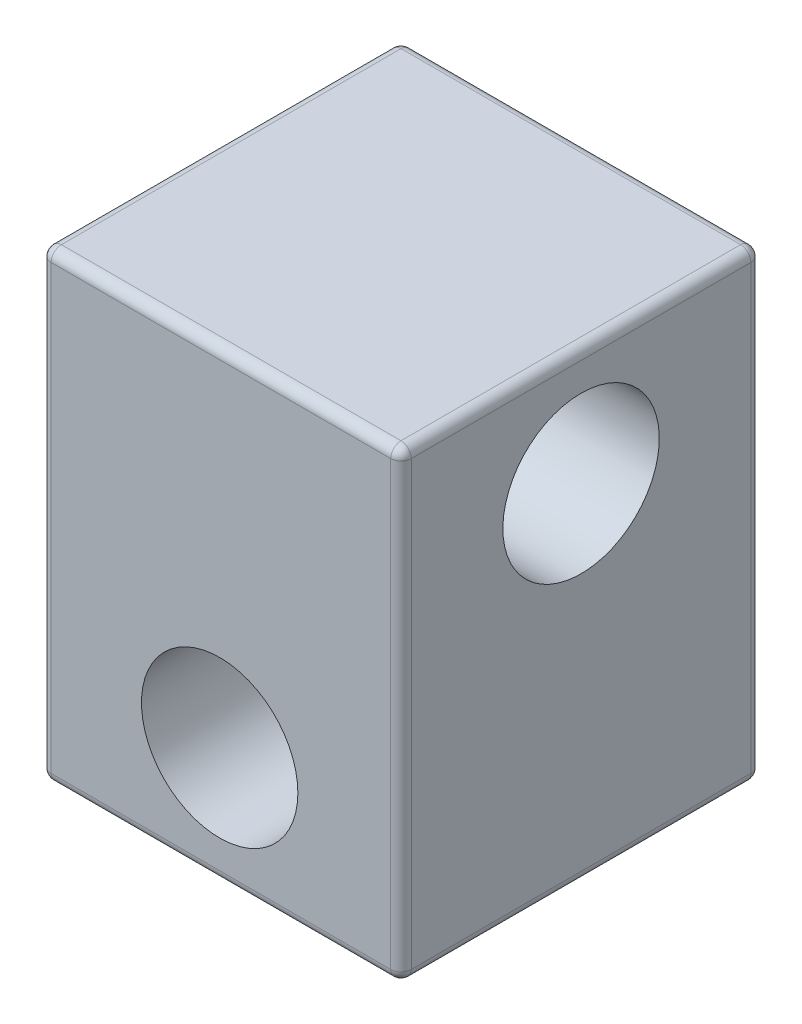
ISO-10303-21;
HEADER;
FILE_DESCRIPTION(('STEP AP214'),'2;1');
FILE_NAME('part.step','',(''),(''),'','','');
FILE_SCHEMA(('AUTOMOTIVE_DESIGN { 1 0 10303 214 1 1 1 1 }'));
ENDSEC;
DATA;
#1=APPLICATION_CONTEXT('core data for automotive mechanical design processes');
#2=APPLICATION_PROTOCOL_DEFINITION('international standard','automotive_design',2000,#1);
#3=PRODUCT_CONTEXT('',#1,'mechanical');
#4=PRODUCT('Part','Part','',(#3));
#5=PRODUCT_RELATED_PRODUCT_CATEGORY('part','',(#4));
#6=PRODUCT_DEFINITION_FORMATION('','',#4);
#7=PRODUCT_DEFINITION_CONTEXT('part definition',#1,'design');
#8=PRODUCT_DEFINITION('design','',#6,#7);
#9=PRODUCT_DEFINITION_SHAPE('','',#8);
#10=(LENGTH_UNIT() NAMED_UNIT(*) SI_UNIT(.MILLI.,.METRE.));
#11=(NAMED_UNIT(*) PLANE_ANGLE_UNIT() SI_UNIT($,.RADIAN.));
#12=(NAMED_UNIT(*) SI_UNIT($,.STERADIAN.) SOLID_ANGLE_UNIT());
#13=UNCERTAINTY_MEASURE_WITH_UNIT(LENGTH_MEASURE(1.E-05),#10,'distance_accuracy_value','');
#14=(GEOMETRIC_REPRESENTATION_CONTEXT(3) GLOBAL_UNCERTAINTY_ASSIGNED_CONTEXT((#13)) GLOBAL_UNIT_ASSIGNED_CONTEXT((#10,
#11,#12)) REPRESENTATION_CONTEXT('',''));
#15=CARTESIAN_POINT('',(0.,0.,0.));
#16=DIRECTION('',(0.,0.,1.));
#17=DIRECTION('',(1.,0.,0.));
#18=AXIS2_PLACEMENT_3D('',#15,#16,#17);
#19=CARTESIAN_POINT('',(0.,0.,35.));
#20=DIRECTION('',(0.,0.,1.));
#21=DIRECTION('',(1.,0.,0.));
#22=AXIS2_PLACEMENT_3D('',#19,#20,#21);
#23=PLANE('',#22);
#24=DIRECTION('',(1.,0.,0.));
#25=VECTOR('',#24,1.);
#26=CARTESIAN_POINT('',(17.6219613719613,-21.5,35.));
#27=LINE('',#26,#25);
#28=CARTESIAN_POINT('',(-16.3780386280387,-21.5,35.));
#29=VERTEX_POINT('',#28);
#30=CARTESIAN_POINT('',(16.6219613719613,-21.5,35.));
#31=VERTEX_POINT('',#30);
#32=EDGE_CURVE('E138',#29,#31,#27,.T.);
#33=ORIENTED_EDGE('',*,*,#32,.T.);
#34=DIRECTION('',(0.,1.,0.));
#35=VECTOR('',#34,1.);
#36=CARTESIAN_POINT('',(16.6219613719613,22.5,35.));
#37=LINE('',#36,#35);
#38=CARTESIAN_POINT('',(16.6219613719613,21.5,35.));
#39=VERTEX_POINT('',#38);
#40=EDGE_CURVE('E190',#31,#39,#37,.T.);
#41=ORIENTED_EDGE('',*,*,#40,.T.);
#42=DIRECTION('',(-1.,0.,0.));
#43=VECTOR('',#42,1.);
#44=CARTESIAN_POINT('',(-17.3780386280387,21.5,35.));
#45=LINE('',#44,#43);
#46=CARTESIAN_POINT('',(-16.3780386280387,21.5,35.));
#47=VERTEX_POINT('',#46);
#48=EDGE_CURVE('E185',#39,#47,#45,.T.);
#49=ORIENTED_EDGE('',*,*,#48,.T.);
#50=DIRECTION('',(0.,-1.,0.));
#51=VECTOR('',#50,1.);
#52=CARTESIAN_POINT('',(-16.3780386280387,-22.5,35.));
#53=LINE('',#52,#51);
#54=EDGE_CURVE('E187',#47,#29,#53,.T.);
#55=ORIENTED_EDGE('',*,*,#54,.T.);
#56=EDGE_LOOP('',(#33,#41,#49,#55));
#57=FACE_BOUND('',#56,.T.);
#58=CARTESIAN_POINT('',(0.,-11.15,35.));
#59=DIRECTION('',(0.,0.,1.));
#60=DIRECTION('',(1.,0.,0.));
#61=AXIS2_PLACEMENT_3D('',#58,#59,#60);
#62=CIRCLE('',#61,7.6);
#63=CARTESIAN_POINT('',(7.6,-11.15,35.));
#64=VERTEX_POINT('',#63);
#65=EDGE_CURVE('E157',#64,#64,#62,.T.);
#66=ORIENTED_EDGE('',*,*,#65,.F.);
#67=EDGE_LOOP('',(#66));
#68=FACE_BOUND('',#67,.T.);
#69=ADVANCED_FACE('F32',(#57,#68),#23,.T.);
#70=CARTESIAN_POINT('',(0.,0.,0.));
#71=DIRECTION('',(0.,0.,1.));
#72=DIRECTION('',(1.,0.,0.));
#73=AXIS2_PLACEMENT_3D('',#70,#71,#72);
#74=PLANE('',#73);
#75=DIRECTION('',(0.,1.,0.));
#76=VECTOR('',#75,1.);
#77=CARTESIAN_POINT('',(16.6219613719613,0.,0.));
#78=LINE('',#77,#76);
#79=CARTESIAN_POINT('',(16.6219613719613,21.5,0.));
#80=VERTEX_POINT('',#79);
#81=CARTESIAN_POINT('',(16.6219613719613,-21.5,0.));
#82=VERTEX_POINT('',#81);
#83=EDGE_CURVE('E171',#80,#82,#78,.F.);
#84=ORIENTED_EDGE('',*,*,#83,.T.);
#85=DIRECTION('',(1.,0.,0.));
#86=VECTOR('',#85,1.);
#87=CARTESIAN_POINT('',(0.,-21.5,0.));
#88=LINE('',#87,#86);
#89=CARTESIAN_POINT('',(-16.3780386280387,-21.5,0.));
#90=VERTEX_POINT('',#89);
#91=EDGE_CURVE('E173',#82,#90,#88,.F.);
#92=ORIENTED_EDGE('',*,*,#91,.T.);
#93=DIRECTION('',(0.,-1.,0.));
#94=VECTOR('',#93,1.);
#95=CARTESIAN_POINT('',(-16.3780386280387,0.,0.));
#96=LINE('',#95,#94);
#97=CARTESIAN_POINT('',(-16.3780386280387,21.5,0.));
#98=VERTEX_POINT('',#97);
#99=EDGE_CURVE('E169',#90,#98,#96,.F.);
#100=ORIENTED_EDGE('',*,*,#99,.T.);
#101=DIRECTION('',(-1.,0.,0.));
#102=VECTOR('',#101,1.);
#103=CARTESIAN_POINT('',(0.,21.5,0.));
#104=LINE('',#103,#102);
#105=EDGE_CURVE('E167',#98,#80,#104,.F.);
#106=ORIENTED_EDGE('',*,*,#105,.T.);
#107=EDGE_LOOP('',(#84,#92,#100,#106));
#108=FACE_BOUND('',#107,.T.);
#109=CARTESIAN_POINT('',(0.,-11.15,0.));
#110=DIRECTION('',(0.,0.,1.));
#111=DIRECTION('',(1.,0.,0.));
#112=AXIS2_PLACEMENT_3D('',#109,#110,#111);
#113=CIRCLE('',#112,7.6);
#114=CARTESIAN_POINT('',(7.6,-11.15,0.));
#115=VERTEX_POINT('',#114);
#116=EDGE_CURVE('E160',#115,#115,#113,.T.);
#117=ORIENTED_EDGE('',*,*,#116,.T.);
#118=EDGE_LOOP('',(#117));
#119=FACE_BOUND('',#118,.T.);
#120=ADVANCED_FACE('F276',(#108,#119),#74,.F.);
#121=CARTESIAN_POINT('',(-17.3780386280387,22.5,35.));
#122=DIRECTION('',(1.,0.,0.));
#123=DIRECTION('',(0.,1.,0.));
#124=AXIS2_PLACEMENT_3D('',#121,#122,#123);
#125=PLANE('',#124);
#126=DIRECTION('',(0.,-1.,0.));
#127=VECTOR('',#126,1.);
#128=CARTESIAN_POINT('',(-17.3780386280387,22.5,1.));
#129=LINE('',#128,#127);
#130=CARTESIAN_POINT('',(-17.3780386280387,21.5,1.));
#131=VERTEX_POINT('',#130);
#132=CARTESIAN_POINT('',(-17.3780386280387,-21.5,1.));
#133=VERTEX_POINT('',#132);
#134=EDGE_CURVE('E197',#131,#133,#129,.T.);
#135=ORIENTED_EDGE('',*,*,#134,.T.);
#136=DIRECTION('',(0.,0.,-1.));
#137=VECTOR('',#136,1.);
#138=CARTESIAN_POINT('',(-17.3780386280387,-21.5,35.));
#139=LINE('',#138,#137);
#140=CARTESIAN_POINT('',(-17.3780386280387,-21.5,34.));
#141=VERTEX_POINT('',#140);
#142=EDGE_CURVE('E199',#133,#141,#139,.F.);
#143=ORIENTED_EDGE('',*,*,#142,.T.);
#144=DIRECTION('',(0.,-1.,0.));
#145=VECTOR('',#144,1.);
#146=CARTESIAN_POINT('',(-17.3780386280387,22.5,34.));
#147=LINE('',#146,#145);
#148=CARTESIAN_POINT('',(-17.3780386280387,21.5,34.));
#149=VERTEX_POINT('',#148);
#150=EDGE_CURVE('E195',#141,#149,#147,.F.);
#151=ORIENTED_EDGE('',*,*,#150,.T.);
#152=DIRECTION('',(0.,0.,-1.));
#153=VECTOR('',#152,1.);
#154=CARTESIAN_POINT('',(-17.3780386280387,21.5,35.));
#155=LINE('',#154,#153);
#156=EDGE_CURVE('E193',#149,#131,#155,.T.);
#157=ORIENTED_EDGE('',*,*,#156,.T.);
#158=EDGE_LOOP('',(#135,#143,#151,#157));
#159=FACE_BOUND('',#158,.T.);
#160=CARTESIAN_POINT('',(-17.3780386280387,11.15,17.5));
#161=DIRECTION('',(1.,0.,0.));
#162=DIRECTION('',(0.,1.,0.));
#163=AXIS2_PLACEMENT_3D('',#160,#161,#162);
#164=CIRCLE('',#163,7.6);
#165=CARTESIAN_POINT('',(-17.3780386280387,18.75,17.5));
#166=VERTEX_POINT('',#165);
#167=EDGE_CURVE('E265',#166,#166,#164,.T.);
#168=ORIENTED_EDGE('',*,*,#167,.T.);
#169=EDGE_LOOP('',(#168));
#170=FACE_BOUND('',#169,.T.);
#171=ADVANCED_FACE('F298',(#159,#170),#125,.F.);
#172=CARTESIAN_POINT('',(-17.3780386280387,-22.5,35.));
#173=DIRECTION('',(0.,1.,0.));
#174=DIRECTION('',(0.,0.,1.));
#175=AXIS2_PLACEMENT_3D('',#172,#173,#174);
#176=PLANE('',#175);
#177=DIRECTION('',(0.,0.,-1.));
#178=VECTOR('',#177,1.);
#179=CARTESIAN_POINT('',(-16.3780386280387,-22.5,35.));
#180=LINE('',#179,#178);
#181=CARTESIAN_POINT('',(-16.3780386280387,-22.5,34.));
#182=VERTEX_POINT('',#181);
#183=CARTESIAN_POINT('',(-16.3780386280387,-22.5,1.));
#184=VERTEX_POINT('',#183);
#185=EDGE_CURVE('E125',#182,#184,#180,.T.);
#186=ORIENTED_EDGE('',*,*,#185,.T.);
#187=DIRECTION('',(1.,0.,0.));
#188=VECTOR('',#187,1.);
#189=CARTESIAN_POINT('',(-17.3780386280387,-22.5,1.));
#190=LINE('',#189,#188);
#191=CARTESIAN_POINT('',(16.6219613719613,-22.5,1.));
#192=VERTEX_POINT('',#191);
#193=EDGE_CURVE('E165',#184,#192,#190,.T.);
#194=ORIENTED_EDGE('',*,*,#193,.T.);
#195=DIRECTION('',(0.,0.,-1.));
#196=VECTOR('',#195,1.);
#197=CARTESIAN_POINT('',(16.6219613719613,-22.5,35.));
#198=LINE('',#197,#196);
#199=CARTESIAN_POINT('',(16.6219613719613,-22.5,34.));
#200=VERTEX_POINT('',#199);
#201=EDGE_CURVE('E128',#192,#200,#198,.F.);
#202=ORIENTED_EDGE('',*,*,#201,.T.);
#203=DIRECTION('',(1.,0.,0.));
#204=VECTOR('',#203,1.);
#205=CARTESIAN_POINT('',(-17.3780386280387,-22.5,34.));
#206=LINE('',#205,#204);
#207=EDGE_CURVE('E120',#200,#182,#206,.F.);
#208=ORIENTED_EDGE('',*,*,#207,.T.);
#209=EDGE_LOOP('',(#186,#194,#202,#208));
#210=FACE_BOUND('',#209,.T.);
#211=ADVANCED_FACE('F122',(#210),#176,.F.);
#212=CARTESIAN_POINT('',(17.6219613719613,22.5,35.));
#213=DIRECTION('',(-1.,0.,0.));
#214=DIRECTION('',(0.,-1.,0.));
#215=AXIS2_PLACEMENT_3D('',#212,#213,#214);
#216=PLANE('',#215);
#217=DIRECTION('',(0.,1.,0.));
#218=VECTOR('',#217,1.);
#219=CARTESIAN_POINT('',(17.6219613719613,-22.5,34.));
#220=LINE('',#219,#218);
#221=CARTESIAN_POINT('',(17.6219613719613,21.5,34.));
#222=VERTEX_POINT('',#221);
#223=CARTESIAN_POINT('',(17.6219613719613,-21.5,34.));
#224=VERTEX_POINT('',#223);
#225=EDGE_CURVE('E178',#222,#224,#220,.F.);
#226=ORIENTED_EDGE('',*,*,#225,.T.);
#227=DIRECTION('',(0.,0.,-1.));
#228=VECTOR('',#227,1.);
#229=CARTESIAN_POINT('',(17.6219613719613,-21.5,35.));
#230=LINE('',#229,#228);
#231=CARTESIAN_POINT('',(17.6219613719613,-21.5,1.));
#232=VERTEX_POINT('',#231);
#233=EDGE_CURVE('E182',#224,#232,#230,.T.);
#234=ORIENTED_EDGE('',*,*,#233,.T.);
#235=DIRECTION('',(0.,1.,0.));
#236=VECTOR('',#235,1.);
#237=CARTESIAN_POINT('',(17.6219613719613,22.5,1.));
#238=LINE('',#237,#236);
#239=CARTESIAN_POINT('',(17.6219613719613,21.5,1.));
#240=VERTEX_POINT('',#239);
#241=EDGE_CURVE('E180',#232,#240,#238,.T.);
#242=ORIENTED_EDGE('',*,*,#241,.T.);
#243=DIRECTION('',(0.,0.,-1.));
#244=VECTOR('',#243,1.);
#245=CARTESIAN_POINT('',(17.6219613719613,21.5,35.));
#246=LINE('',#245,#244);
#247=EDGE_CURVE('E176',#240,#222,#246,.F.);
#248=ORIENTED_EDGE('',*,*,#247,.T.);
#249=EDGE_LOOP('',(#226,#234,#242,#248));
#250=FACE_BOUND('',#249,.T.);
#251=CARTESIAN_POINT('',(17.6219613719613,11.15,17.5));
#252=DIRECTION('',(1.,0.,0.));
#253=DIRECTION('',(0.,1.,0.));
#254=AXIS2_PLACEMENT_3D('',#251,#252,#253);
#255=CIRCLE('',#254,7.6);
#256=CARTESIAN_POINT('',(17.6219613719613,18.75,17.5));
#257=VERTEX_POINT('',#256);
#258=EDGE_CURVE('E259',#257,#257,#255,.T.);
#259=ORIENTED_EDGE('',*,*,#258,.F.);
#260=EDGE_LOOP('',(#259));
#261=FACE_BOUND('',#260,.T.);
#262=ADVANCED_FACE('F290',(#250,#261),#216,.F.);
#263=CARTESIAN_POINT('',(-17.3780386280387,22.5,35.));
#264=DIRECTION('',(0.,-1.,0.));
#265=DIRECTION('',(0.,0.,-1.));
#266=AXIS2_PLACEMENT_3D('',#263,#264,#265);
#267=PLANE('',#266);
#268=DIRECTION('',(0.,0.,-1.));
#269=VECTOR('',#268,1.);
#270=CARTESIAN_POINT('',(16.6219613719613,22.5,35.));
#271=LINE('',#270,#269);
#272=CARTESIAN_POINT('',(16.6219613719613,22.5,34.));
#273=VERTEX_POINT('',#272);
#274=CARTESIAN_POINT('',(16.6219613719613,22.5,1.));
#275=VERTEX_POINT('',#274);
#276=EDGE_CURVE('E41',#273,#275,#271,.T.);
#277=ORIENTED_EDGE('',*,*,#276,.T.);
#278=DIRECTION('',(-1.,0.,0.));
#279=VECTOR('',#278,1.);
#280=CARTESIAN_POINT('',(-17.3780386280387,22.5,1.));
#281=LINE('',#280,#279);
#282=CARTESIAN_POINT('',(-16.3780386280387,22.5,1.));
#283=VERTEX_POINT('',#282);
#284=EDGE_CURVE('E11',#275,#283,#281,.T.);
#285=ORIENTED_EDGE('',*,*,#284,.T.);
#286=DIRECTION('',(0.,0.,-1.));
#287=VECTOR('',#286,1.);
#288=CARTESIAN_POINT('',(-16.3780386280387,22.5,35.));
#289=LINE('',#288,#287);
#290=CARTESIAN_POINT('',(-16.3780386280387,22.5,34.));
#291=VERTEX_POINT('',#290);
#292=EDGE_CURVE('E202',#283,#291,#289,.F.);
#293=ORIENTED_EDGE('',*,*,#292,.T.);
#294=DIRECTION('',(-1.,0.,0.));
#295=VECTOR('',#294,1.);
#296=CARTESIAN_POINT('',(17.6219613719613,22.5,34.));
#297=LINE('',#296,#295);
#298=EDGE_CURVE('E52',#291,#273,#297,.F.);
#299=ORIENTED_EDGE('',*,*,#298,.T.);
#300=EDGE_LOOP('',(#277,#285,#293,#299));
#301=FACE_BOUND('',#300,.T.);
#302=ADVANCED_FACE('F281',(#301),#267,.F.);
#303=CARTESIAN_POINT('',(0.,-11.15,35.));
#304=DIRECTION('',(0.,0.,-1.));
#305=DIRECTION('',(-1.,0.,0.));
#306=AXIS2_PLACEMENT_3D('',#303,#304,#305);
#307=CYLINDRICAL_SURFACE('',#306,7.6);
#308=ORIENTED_EDGE('',*,*,#65,.T.);
#309=EDGE_LOOP('',(#308));
#310=FACE_BOUND('',#309,.T.);
#311=ORIENTED_EDGE('',*,*,#116,.F.);
#312=EDGE_LOOP('',(#311));
#313=FACE_BOUND('',#312,.T.);
#314=ADVANCED_FACE('F278',(#310,#313),#307,.F.);
#315=CARTESIAN_POINT('',(-17.3780386280387,11.15,17.5));
#316=DIRECTION('',(1.,0.,0.));
#317=DIRECTION('',(0.,1.,0.));
#318=AXIS2_PLACEMENT_3D('',#315,#316,#317);
#319=CYLINDRICAL_SURFACE('',#318,7.6);
#320=ORIENTED_EDGE('',*,*,#167,.F.);
#321=EDGE_LOOP('',(#320));
#322=FACE_BOUND('',#321,.T.);
#323=ORIENTED_EDGE('',*,*,#258,.T.);
#324=EDGE_LOOP('',(#323));
#325=FACE_BOUND('',#324,.T.);
#326=ADVANCED_FACE('F280',(#322,#325),#319,.F.);
#327=CARTESIAN_POINT('',(0.,21.5,34.));
#328=DIRECTION('',(1.,0.,0.));
#329=DIRECTION('',(0.,0.,-1.));
#330=AXIS2_PLACEMENT_3D('',#327,#328,#329);
#331=CYLINDRICAL_SURFACE('',#330,1.);
#332=CARTESIAN_POINT('',(-16.3780386280387,21.5,34.));
#333=DIRECTION('',(-1.,0.,0.));
#334=DIRECTION('',(0.,-1.,0.));
#335=AXIS2_PLACEMENT_3D('',#332,#333,#334);
#336=CIRCLE('',#335,1.);
#337=EDGE_CURVE('E36',#47,#291,#336,.T.);
#338=ORIENTED_EDGE('',*,*,#337,.F.);
#339=ORIENTED_EDGE('',*,*,#48,.F.);
#340=CARTESIAN_POINT('',(16.6219613719613,21.5,34.));
#341=DIRECTION('',(1.,0.,0.));
#342=DIRECTION('',(0.,0.,-1.));
#343=AXIS2_PLACEMENT_3D('',#340,#341,#342);
#344=CIRCLE('',#343,1.);
#345=EDGE_CURVE('E252',#273,#39,#344,.T.);
#346=ORIENTED_EDGE('',*,*,#345,.F.);
#347=ORIENTED_EDGE('',*,*,#298,.F.);
#348=EDGE_LOOP('',(#338,#339,#346,#347));
#349=FACE_BOUND('',#348,.T.);
#350=ADVANCED_FACE('F34',(#349),#331,.T.);
#351=CARTESIAN_POINT('',(-16.3780386280387,21.5,34.));
#352=DIRECTION('',(0.,0.,1.));
#353=DIRECTION('',(1.,0.,0.));
#354=AXIS2_PLACEMENT_3D('',#351,#352,#353);
#355=SPHERICAL_SURFACE('',#354,1.);
#356=CARTESIAN_POINT('',(-16.3780386280387,21.5,34.));
#357=DIRECTION('',(0.,1.,0.));
#358=DIRECTION('',(0.,0.,1.));
#359=AXIS2_PLACEMENT_3D('',#356,#357,#358);
#360=CIRCLE('',#359,1.);
#361=EDGE_CURVE('E247',#47,#149,#360,.F.);
#362=ORIENTED_EDGE('',*,*,#361,.F.);
#363=ORIENTED_EDGE('',*,*,#337,.T.);
#364=CARTESIAN_POINT('',(-16.3780386280387,21.5,34.));
#365=DIRECTION('',(0.,0.,1.));
#366=DIRECTION('',(1.,0.,0.));
#367=AXIS2_PLACEMENT_3D('',#364,#365,#366);
#368=CIRCLE('',#367,1.);
#369=EDGE_CURVE('E250',#149,#291,#368,.F.);
#370=ORIENTED_EDGE('',*,*,#369,.F.);
#371=EDGE_LOOP('',(#362,#363,#370));
#372=FACE_BOUND('',#371,.T.);
#373=ADVANCED_FACE('F375',(#372),#355,.T.);
#374=CARTESIAN_POINT('',(16.6219613719613,21.5,34.));
#375=DIRECTION('',(0.,0.,1.));
#376=DIRECTION('',(1.,0.,0.));
#377=AXIS2_PLACEMENT_3D('',#374,#375,#376);
#378=SPHERICAL_SURFACE('',#377,1.);
#379=CARTESIAN_POINT('',(16.6219613719613,21.5,34.));
#380=DIRECTION('',(0.,0.,1.));
#381=DIRECTION('',(1.,0.,0.));
#382=AXIS2_PLACEMENT_3D('',#379,#380,#381);
#383=CIRCLE('',#382,1.);
#384=EDGE_CURVE('E242',#273,#222,#383,.F.);
#385=ORIENTED_EDGE('',*,*,#384,.F.);
#386=ORIENTED_EDGE('',*,*,#345,.T.);
#387=CARTESIAN_POINT('',(16.6219613719613,21.5,34.));
#388=DIRECTION('',(0.,1.,0.));
#389=DIRECTION('',(0.,0.,1.));
#390=AXIS2_PLACEMENT_3D('',#387,#388,#389);
#391=CIRCLE('',#390,1.);
#392=EDGE_CURVE('E245',#222,#39,#391,.F.);
#393=ORIENTED_EDGE('',*,*,#392,.F.);
#394=EDGE_LOOP('',(#385,#386,#393));
#395=FACE_BOUND('',#394,.T.);
#396=ADVANCED_FACE('F372',(#395),#378,.T.);
#397=CARTESIAN_POINT('',(-16.3780386280387,21.5,35.));
#398=DIRECTION('',(0.,0.,-1.));
#399=DIRECTION('',(-1.,0.,0.));
#400=AXIS2_PLACEMENT_3D('',#397,#398,#399);
#401=CYLINDRICAL_SURFACE('',#400,1.);
#402=ORIENTED_EDGE('',*,*,#369,.T.);
#403=ORIENTED_EDGE('',*,*,#292,.F.);
#404=CARTESIAN_POINT('',(-16.3780386280387,21.5,1.));
#405=DIRECTION('',(0.,0.,-1.));
#406=DIRECTION('',(-1.,0.,0.));
#407=AXIS2_PLACEMENT_3D('',#404,#405,#406);
#408=CIRCLE('',#407,1.);
#409=EDGE_CURVE('E237',#131,#283,#408,.T.);
#410=ORIENTED_EDGE('',*,*,#409,.F.);
#411=ORIENTED_EDGE('',*,*,#156,.F.);
#412=EDGE_LOOP('',(#402,#403,#410,#411));
#413=FACE_BOUND('',#412,.T.);
#414=ADVANCED_FACE('F368',(#413),#401,.T.);
#415=CARTESIAN_POINT('',(-16.3780386280387,0.,34.));
#416=DIRECTION('',(0.,1.,0.));
#417=DIRECTION('',(-1.,0.,0.));
#418=AXIS2_PLACEMENT_3D('',#415,#416,#417);
#419=CYLINDRICAL_SURFACE('',#418,1.);
#420=ORIENTED_EDGE('',*,*,#361,.T.);
#421=ORIENTED_EDGE('',*,*,#150,.F.);
#422=CARTESIAN_POINT('',(-16.3780386280387,-21.5,34.));
#423=DIRECTION('',(0.,-1.,0.));
#424=DIRECTION('',(0.,0.,-1.));
#425=AXIS2_PLACEMENT_3D('',#422,#423,#424);
#426=CIRCLE('',#425,1.);
#427=EDGE_CURVE('E142',#29,#141,#426,.T.);
#428=ORIENTED_EDGE('',*,*,#427,.F.);
#429=ORIENTED_EDGE('',*,*,#54,.F.);
#430=EDGE_LOOP('',(#420,#421,#428,#429));
#431=FACE_BOUND('',#430,.T.);
#432=ADVANCED_FACE('F365',(#431),#419,.T.);
#433=CARTESIAN_POINT('',(0.,-21.5,34.));
#434=DIRECTION('',(-1.,0.,0.));
#435=DIRECTION('',(0.,0.,1.));
#436=AXIS2_PLACEMENT_3D('',#433,#434,#435);
#437=CYLINDRICAL_SURFACE('',#436,1.);
#438=CARTESIAN_POINT('',(16.6219613719613,-21.5,34.));
#439=DIRECTION('',(1.,0.,0.));
#440=DIRECTION('',(0.,0.,-1.));
#441=AXIS2_PLACEMENT_3D('',#438,#439,#440);
#442=CIRCLE('',#441,1.);
#443=EDGE_CURVE('E143',#31,#200,#442,.T.);
#444=ORIENTED_EDGE('',*,*,#443,.F.);
#445=ORIENTED_EDGE('',*,*,#32,.F.);
#446=CARTESIAN_POINT('',(-16.3780386280387,-21.5,34.));
#447=DIRECTION('',(-1.,0.,0.));
#448=DIRECTION('',(0.,0.,1.));
#449=AXIS2_PLACEMENT_3D('',#446,#447,#448);
#450=CIRCLE('',#449,1.);
#451=EDGE_CURVE('E135',#182,#29,#450,.T.);
#452=ORIENTED_EDGE('',*,*,#451,.F.);
#453=ORIENTED_EDGE('',*,*,#207,.F.);
#454=EDGE_LOOP('',(#444,#445,#452,#453));
#455=FACE_BOUND('',#454,.T.);
#456=ADVANCED_FACE('F137',(#455),#437,.T.);
#457=CARTESIAN_POINT('',(16.6219613719613,0.,34.));
#458=DIRECTION('',(0.,-1.,0.));
#459=DIRECTION('',(1.,0.,0.));
#460=AXIS2_PLACEMENT_3D('',#457,#458,#459);
#461=CYLINDRICAL_SURFACE('',#460,1.);
#462=ORIENTED_EDGE('',*,*,#392,.T.);
#463=ORIENTED_EDGE('',*,*,#40,.F.);
#464=CARTESIAN_POINT('',(16.6219613719613,-21.5,34.));
#465=DIRECTION('',(0.,-1.,0.));
#466=DIRECTION('',(0.,0.,-1.));
#467=AXIS2_PLACEMENT_3D('',#464,#465,#466);
#468=CIRCLE('',#467,1.);
#469=EDGE_CURVE('E232',#224,#31,#468,.T.);
#470=ORIENTED_EDGE('',*,*,#469,.F.);
#471=ORIENTED_EDGE('',*,*,#225,.F.);
#472=EDGE_LOOP('',(#462,#463,#470,#471));
#473=FACE_BOUND('',#472,.T.);
#474=ADVANCED_FACE('F358',(#473),#461,.T.);
#475=CARTESIAN_POINT('',(16.6219613719613,21.5,35.));
#476=DIRECTION('',(0.,0.,-1.));
#477=DIRECTION('',(-1.,0.,0.));
#478=AXIS2_PLACEMENT_3D('',#475,#476,#477);
#479=CYLINDRICAL_SURFACE('',#478,1.);
#480=ORIENTED_EDGE('',*,*,#384,.T.);
#481=ORIENTED_EDGE('',*,*,#247,.F.);
#482=CARTESIAN_POINT('',(16.6219613719613,21.5,1.));
#483=DIRECTION('',(0.,0.,-1.));
#484=DIRECTION('',(-1.,0.,0.));
#485=AXIS2_PLACEMENT_3D('',#482,#483,#484);
#486=CIRCLE('',#485,1.);
#487=EDGE_CURVE('E229',#275,#240,#486,.T.);
#488=ORIENTED_EDGE('',*,*,#487,.F.);
#489=ORIENTED_EDGE('',*,*,#276,.F.);
#490=EDGE_LOOP('',(#480,#481,#488,#489));
#491=FACE_BOUND('',#490,.T.);
#492=ADVANCED_FACE('F354',(#491),#479,.T.);
#493=CARTESIAN_POINT('',(-17.3780386280387,21.5,1.));
#494=DIRECTION('',(-1.,0.,0.));
#495=DIRECTION('',(0.,0.,1.));
#496=AXIS2_PLACEMENT_3D('',#493,#494,#495);
#497=CYLINDRICAL_SURFACE('',#496,1.);
#498=CARTESIAN_POINT('',(-16.3780386280387,21.5,1.));
#499=DIRECTION('',(-1.,0.,0.));
#500=DIRECTION('',(0.,0.,1.));
#501=AXIS2_PLACEMENT_3D('',#498,#499,#500);
#502=CIRCLE('',#501,1.);
#503=EDGE_CURVE('E239',#283,#98,#502,.T.);
#504=ORIENTED_EDGE('',*,*,#503,.F.);
#505=ORIENTED_EDGE('',*,*,#284,.F.);
#506=CARTESIAN_POINT('',(16.6219613719613,21.5,1.));
#507=DIRECTION('',(1.,0.,0.));
#508=DIRECTION('',(0.,1.,0.));
#509=AXIS2_PLACEMENT_3D('',#506,#507,#508);
#510=CIRCLE('',#509,1.);
#511=EDGE_CURVE('E226',#80,#275,#510,.T.);
#512=ORIENTED_EDGE('',*,*,#511,.F.);
#513=ORIENTED_EDGE('',*,*,#105,.F.);
#514=EDGE_LOOP('',(#504,#505,#512,#513));
#515=FACE_BOUND('',#514,.T.);
#516=ADVANCED_FACE('F350',(#515),#497,.T.);
#517=CARTESIAN_POINT('',(-16.3780386280387,21.5,1.));
#518=DIRECTION('',(0.,0.,1.));
#519=DIRECTION('',(1.,0.,0.));
#520=AXIS2_PLACEMENT_3D('',#517,#518,#519);
#521=SPHERICAL_SURFACE('',#520,1.);
#522=ORIENTED_EDGE('',*,*,#409,.T.);
#523=ORIENTED_EDGE('',*,*,#503,.T.);
#524=CARTESIAN_POINT('',(-16.3780386280387,21.5,1.));
#525=DIRECTION('',(0.,1.,0.));
#526=DIRECTION('',(0.,0.,1.));
#527=AXIS2_PLACEMENT_3D('',#524,#525,#526);
#528=CIRCLE('',#527,1.);
#529=EDGE_CURVE('E150',#131,#98,#528,.F.);
#530=ORIENTED_EDGE('',*,*,#529,.F.);
#531=EDGE_LOOP('',(#522,#523,#530));
#532=FACE_BOUND('',#531,.T.);
#533=ADVANCED_FACE('F347',(#532),#521,.T.);
#534=CARTESIAN_POINT('',(-16.3780386280387,-21.5,34.));
#535=DIRECTION('',(0.,0.,1.));
#536=DIRECTION('',(1.,0.,0.));
#537=AXIS2_PLACEMENT_3D('',#534,#535,#536);
#538=SPHERICAL_SURFACE('',#537,1.);
#539=ORIENTED_EDGE('',*,*,#451,.T.);
#540=ORIENTED_EDGE('',*,*,#427,.T.);
#541=CARTESIAN_POINT('',(-16.3780386280387,-21.5,34.));
#542=DIRECTION('',(0.,0.,1.));
#543=DIRECTION('',(1.,0.,0.));
#544=AXIS2_PLACEMENT_3D('',#541,#542,#543);
#545=CIRCLE('',#544,1.);
#546=EDGE_CURVE('E145',#182,#141,#545,.F.);
#547=ORIENTED_EDGE('',*,*,#546,.F.);
#548=EDGE_LOOP('',(#539,#540,#547));
#549=FACE_BOUND('',#548,.T.);
#550=ADVANCED_FACE('F146',(#549),#538,.T.);
#551=CARTESIAN_POINT('',(16.6219613719613,-21.5,34.));
#552=DIRECTION('',(0.,0.,1.));
#553=DIRECTION('',(1.,0.,0.));
#554=AXIS2_PLACEMENT_3D('',#551,#552,#553);
#555=SPHERICAL_SURFACE('',#554,1.);
#556=ORIENTED_EDGE('',*,*,#469,.T.);
#557=ORIENTED_EDGE('',*,*,#443,.T.);
#558=CARTESIAN_POINT('',(16.6219613719613,-21.5,34.));
#559=DIRECTION('',(0.,0.,1.));
#560=DIRECTION('',(1.,0.,0.));
#561=AXIS2_PLACEMENT_3D('',#558,#559,#560);
#562=CIRCLE('',#561,1.);
#563=EDGE_CURVE('E151',#224,#200,#562,.F.);
#564=ORIENTED_EDGE('',*,*,#563,.F.);
#565=EDGE_LOOP('',(#556,#557,#564));
#566=FACE_BOUND('',#565,.T.);
#567=ADVANCED_FACE('F340',(#566),#555,.T.);
#568=CARTESIAN_POINT('',(16.6219613719613,21.5,1.));
#569=DIRECTION('',(0.,0.,1.));
#570=DIRECTION('',(1.,0.,0.));
#571=AXIS2_PLACEMENT_3D('',#568,#569,#570);
#572=SPHERICAL_SURFACE('',#571,1.);
#573=ORIENTED_EDGE('',*,*,#511,.T.);
#574=ORIENTED_EDGE('',*,*,#487,.T.);
#575=CARTESIAN_POINT('',(16.6219613719613,21.5,1.));
#576=DIRECTION('',(0.,1.,0.));
#577=DIRECTION('',(0.,0.,1.));
#578=AXIS2_PLACEMENT_3D('',#575,#576,#577);
#579=CIRCLE('',#578,1.);
#580=EDGE_CURVE('E219',#80,#240,#579,.F.);
#581=ORIENTED_EDGE('',*,*,#580,.F.);
#582=EDGE_LOOP('',(#573,#574,#581));
#583=FACE_BOUND('',#582,.T.);
#584=ADVANCED_FACE('F336',(#583),#572,.T.);
#585=CARTESIAN_POINT('',(-16.3780386280387,22.5,1.));
#586=DIRECTION('',(0.,-1.,0.));
#587=DIRECTION('',(1.,0.,0.));
#588=AXIS2_PLACEMENT_3D('',#585,#586,#587);
#589=CYLINDRICAL_SURFACE('',#588,1.);
#590=ORIENTED_EDGE('',*,*,#529,.T.);
#591=ORIENTED_EDGE('',*,*,#99,.F.);
#592=CARTESIAN_POINT('',(-16.3780386280387,-21.5,1.));
#593=DIRECTION('',(0.,-1.,0.));
#594=DIRECTION('',(0.,0.,-1.));
#595=AXIS2_PLACEMENT_3D('',#592,#593,#594);
#596=CIRCLE('',#595,1.);
#597=EDGE_CURVE('E216',#133,#90,#596,.T.);
#598=ORIENTED_EDGE('',*,*,#597,.F.);
#599=ORIENTED_EDGE('',*,*,#134,.F.);
#600=EDGE_LOOP('',(#590,#591,#598,#599));
#601=FACE_BOUND('',#600,.T.);
#602=ADVANCED_FACE('F333',(#601),#589,.T.);
#603=CARTESIAN_POINT('',(-16.3780386280387,-21.5,35.));
#604=DIRECTION('',(0.,0.,-1.));
#605=DIRECTION('',(-1.,0.,0.));
#606=AXIS2_PLACEMENT_3D('',#603,#604,#605);
#607=CYLINDRICAL_SURFACE('',#606,1.);
#608=ORIENTED_EDGE('',*,*,#546,.T.);
#609=ORIENTED_EDGE('',*,*,#142,.F.);
#610=CARTESIAN_POINT('',(-16.3780386280387,-21.5,1.));
#611=DIRECTION('',(0.,0.,-1.));
#612=DIRECTION('',(-1.,0.,0.));
#613=AXIS2_PLACEMENT_3D('',#610,#611,#612);
#614=CIRCLE('',#613,1.);
#615=EDGE_CURVE('E155',#184,#133,#614,.T.);
#616=ORIENTED_EDGE('',*,*,#615,.F.);
#617=ORIENTED_EDGE('',*,*,#185,.F.);
#618=EDGE_LOOP('',(#608,#609,#616,#617));
#619=FACE_BOUND('',#618,.T.);
#620=ADVANCED_FACE('F153',(#619),#607,.T.);
#621=CARTESIAN_POINT('',(16.6219613719613,-21.5,35.));
#622=DIRECTION('',(0.,0.,-1.));
#623=DIRECTION('',(-1.,0.,0.));
#624=AXIS2_PLACEMENT_3D('',#621,#622,#623);
#625=CYLINDRICAL_SURFACE('',#624,1.);
#626=ORIENTED_EDGE('',*,*,#563,.T.);
#627=ORIENTED_EDGE('',*,*,#201,.F.);
#628=CARTESIAN_POINT('',(16.6219613719613,-21.5,1.));
#629=DIRECTION('',(0.,0.,-1.));
#630=DIRECTION('',(-1.,0.,0.));
#631=AXIS2_PLACEMENT_3D('',#628,#629,#630);
#632=CIRCLE('',#631,1.);
#633=EDGE_CURVE('E212',#232,#192,#632,.T.);
#634=ORIENTED_EDGE('',*,*,#633,.F.);
#635=ORIENTED_EDGE('',*,*,#233,.F.);
#636=EDGE_LOOP('',(#626,#627,#634,#635));
#637=FACE_BOUND('',#636,.T.);
#638=ADVANCED_FACE('F326',(#637),#625,.T.);
#639=CARTESIAN_POINT('',(16.6219613719613,22.5,1.));
#640=DIRECTION('',(0.,1.,0.));
#641=DIRECTION('',(-1.,0.,0.));
#642=AXIS2_PLACEMENT_3D('',#639,#640,#641);
#643=CYLINDRICAL_SURFACE('',#642,1.);
#644=ORIENTED_EDGE('',*,*,#580,.T.);
#645=ORIENTED_EDGE('',*,*,#241,.F.);
#646=CARTESIAN_POINT('',(16.6219613719613,-21.5,1.));
#647=DIRECTION('',(0.,-1.,0.));
#648=DIRECTION('',(0.,0.,-1.));
#649=AXIS2_PLACEMENT_3D('',#646,#647,#648);
#650=CIRCLE('',#649,1.);
#651=EDGE_CURVE('E210',#82,#232,#650,.T.);
#652=ORIENTED_EDGE('',*,*,#651,.F.);
#653=ORIENTED_EDGE('',*,*,#83,.F.);
#654=EDGE_LOOP('',(#644,#645,#652,#653));
#655=FACE_BOUND('',#654,.T.);
#656=ADVANCED_FACE('F322',(#655),#643,.T.);
#657=CARTESIAN_POINT('',(-16.3780386280387,-21.5,1.));
#658=DIRECTION('',(0.,0.,1.));
#659=DIRECTION('',(1.,0.,0.));
#660=AXIS2_PLACEMENT_3D('',#657,#658,#659);
#661=SPHERICAL_SURFACE('',#660,1.);
#662=ORIENTED_EDGE('',*,*,#615,.T.);
#663=ORIENTED_EDGE('',*,*,#597,.T.);
#664=CARTESIAN_POINT('',(-16.3780386280387,-21.5,1.));
#665=DIRECTION('',(-1.,0.,0.));
#666=DIRECTION('',(0.,0.,1.));
#667=AXIS2_PLACEMENT_3D('',#664,#665,#666);
#668=CIRCLE('',#667,1.);
#669=EDGE_CURVE('E208',#184,#90,#668,.F.);
#670=ORIENTED_EDGE('',*,*,#669,.F.);
#671=EDGE_LOOP('',(#662,#663,#670));
#672=FACE_BOUND('',#671,.T.);
#673=ADVANCED_FACE('F318',(#672),#661,.T.);
#674=CARTESIAN_POINT('',(16.6219613719613,-21.5,1.));
#675=DIRECTION('',(0.,0.,1.));
#676=DIRECTION('',(1.,0.,0.));
#677=AXIS2_PLACEMENT_3D('',#674,#675,#676);
#678=SPHERICAL_SURFACE('',#677,1.);
#679=ORIENTED_EDGE('',*,*,#651,.T.);
#680=ORIENTED_EDGE('',*,*,#633,.T.);
#681=CARTESIAN_POINT('',(16.6219613719613,-21.5,1.));
#682=DIRECTION('',(1.,0.,0.));
#683=DIRECTION('',(0.,0.,-1.));
#684=AXIS2_PLACEMENT_3D('',#681,#682,#683);
#685=CIRCLE('',#684,1.);
#686=EDGE_CURVE('E206',#82,#192,#685,.F.);
#687=ORIENTED_EDGE('',*,*,#686,.F.);
#688=EDGE_LOOP('',(#679,#680,#687));
#689=FACE_BOUND('',#688,.T.);
#690=ADVANCED_FACE('F314',(#689),#678,.T.);
#691=CARTESIAN_POINT('',(-17.3780386280387,-21.5,1.));
#692=DIRECTION('',(1.,0.,0.));
#693=DIRECTION('',(0.,0.,-1.));
#694=AXIS2_PLACEMENT_3D('',#691,#692,#693);
#695=CYLINDRICAL_SURFACE('',#694,1.);
#696=ORIENTED_EDGE('',*,*,#669,.T.);
#697=ORIENTED_EDGE('',*,*,#91,.F.);
#698=ORIENTED_EDGE('',*,*,#686,.T.);
#699=ORIENTED_EDGE('',*,*,#193,.F.);
#700=EDGE_LOOP('',(#696,#697,#698,#699));
#701=FACE_BOUND('',#700,.T.);
#702=ADVANCED_FACE('F311',(#701),#695,.T.);
#703=CLOSED_SHELL('',(#69,#120,#171,#211,#262,#302,#314,#326,#350,#373,#396,#414,#432,#456,#474,
#492,#516,#533,#550,#567,#584,#602,#620,#638,#656,#673,#690,#702));
#704=MANIFOLD_SOLID_BREP('B2',#703);
#705=ADVANCED_BREP_SHAPE_REPRESENTATION('',(#18,#704),#14);
#706=SHAPE_DEFINITION_REPRESENTATION(#9,#705);
ENDSEC;
END-ISO-10303-21;
